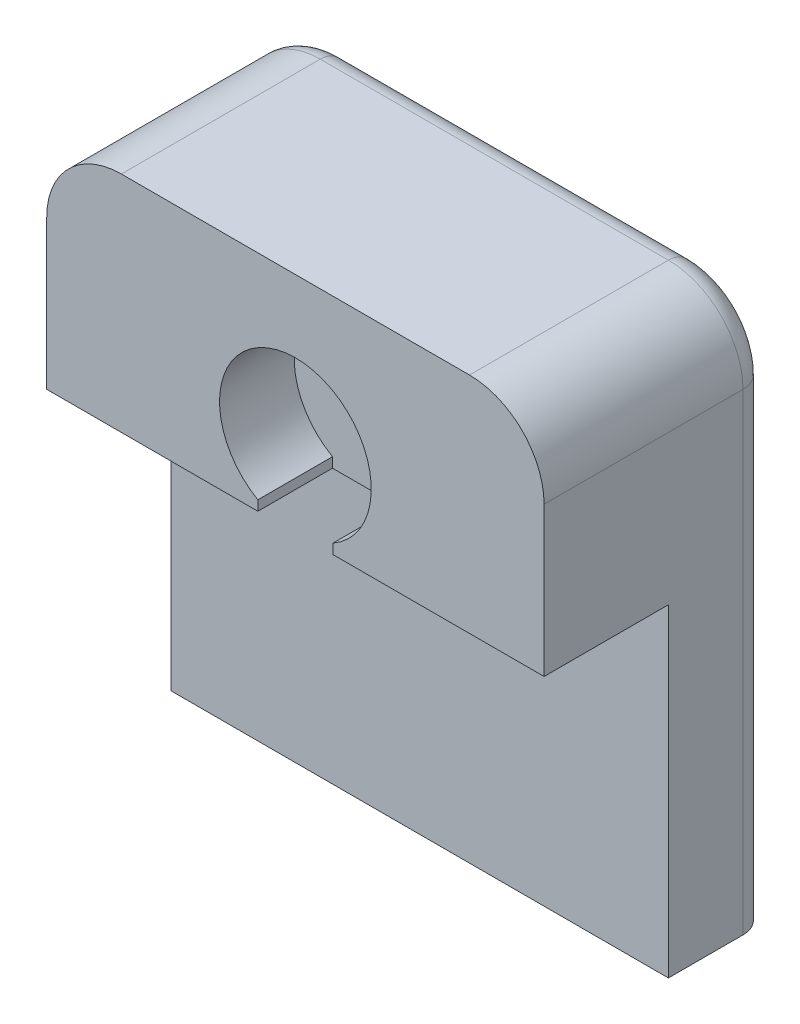
ISO-10303-21;
HEADER;
FILE_DESCRIPTION(('STEP AP214'),'2;1');
FILE_NAME('part.step','',(''),(''),'','','');
FILE_SCHEMA(('AUTOMOTIVE_DESIGN { 1 0 10303 214 1 1 1 1 }'));
ENDSEC;
DATA;
#1=APPLICATION_CONTEXT('core data for automotive mechanical design processes');
#2=APPLICATION_PROTOCOL_DEFINITION('international standard','automotive_design',2000,#1);
#3=PRODUCT_CONTEXT('',#1,'mechanical');
#4=PRODUCT('Part','Part','',(#3));
#5=PRODUCT_RELATED_PRODUCT_CATEGORY('part','',(#4));
#6=PRODUCT_DEFINITION_FORMATION('','',#4);
#7=PRODUCT_DEFINITION_CONTEXT('part definition',#1,'design');
#8=PRODUCT_DEFINITION('design','',#6,#7);
#9=PRODUCT_DEFINITION_SHAPE('','',#8);
#10=(LENGTH_UNIT() NAMED_UNIT(*) SI_UNIT(.MILLI.,.METRE.));
#11=(NAMED_UNIT(*) PLANE_ANGLE_UNIT() SI_UNIT($,.RADIAN.));
#12=(NAMED_UNIT(*) SI_UNIT($,.STERADIAN.) SOLID_ANGLE_UNIT());
#13=UNCERTAINTY_MEASURE_WITH_UNIT(LENGTH_MEASURE(1.E-05),#10,'distance_accuracy_value','');
#14=(GEOMETRIC_REPRESENTATION_CONTEXT(3) GLOBAL_UNCERTAINTY_ASSIGNED_CONTEXT((#13)) GLOBAL_UNIT_ASSIGNED_CONTEXT((#10,
#11,#12)) REPRESENTATION_CONTEXT('',''));
#15=CARTESIAN_POINT('',(0.,0.,0.));
#16=DIRECTION('',(0.,0.,1.));
#17=DIRECTION('',(1.,0.,0.));
#18=AXIS2_PLACEMENT_3D('',#15,#16,#17);
#19=CARTESIAN_POINT('',(-10.,4.5,13.));
#20=DIRECTION('',(1.,0.,0.));
#21=DIRECTION('',(0.,0.,-1.));
#22=AXIS2_PLACEMENT_3D('',#19,#20,#21);
#23=PLANE('',#22);
#24=DIRECTION('',(0.,0.,-1.));
#25=VECTOR('',#24,1.);
#26=CARTESIAN_POINT('',(-10.,1.5,13.));
#27=LINE('',#26,#25);
#28=CARTESIAN_POINT('',(-10.,1.5,13.));
#29=VERTEX_POINT('',#28);
#30=CARTESIAN_POINT('',(-10.,1.5,5.));
#31=VERTEX_POINT('',#30);
#32=EDGE_CURVE('E251',#29,#31,#27,.T.);
#33=ORIENTED_EDGE('',*,*,#32,.T.);
#34=DIRECTION('',(0.,-1.,0.));
#35=VECTOR('',#34,1.);
#36=CARTESIAN_POINT('',(-10.,-17.5,5.));
#37=LINE('',#36,#35);
#38=CARTESIAN_POINT('',(-10.,-17.5,5.));
#39=VERTEX_POINT('',#38);
#40=EDGE_CURVE('E11',#31,#39,#37,.T.);
#41=ORIENTED_EDGE('',*,*,#40,.T.);
#42=DIRECTION('',(0.,0.,-1.));
#43=VECTOR('',#42,1.);
#44=CARTESIAN_POINT('',(-10.,-17.5,0.));
#45=LINE('',#44,#43);
#46=CARTESIAN_POINT('',(-10.,-17.5,8.));
#47=VERTEX_POINT('',#46);
#48=EDGE_CURVE('E189',#47,#39,#45,.T.);
#49=ORIENTED_EDGE('',*,*,#48,.F.);
#50=DIRECTION('',(0.,1.,0.));
#51=VECTOR('',#50,1.);
#52=CARTESIAN_POINT('',(-10.,-17.5,8.));
#53=LINE('',#52,#51);
#54=CARTESIAN_POINT('',(-10.,-4.5,8.));
#55=VERTEX_POINT('',#54);
#56=EDGE_CURVE('E177',#47,#55,#53,.T.);
#57=ORIENTED_EDGE('',*,*,#56,.T.);
#58=DIRECTION('',(0.,0.,-1.));
#59=VECTOR('',#58,1.);
#60=CARTESIAN_POINT('',(-10.,-4.5,13.));
#61=LINE('',#60,#59);
#62=CARTESIAN_POINT('',(-10.,-4.5,13.));
#63=VERTEX_POINT('',#62);
#64=EDGE_CURVE('E247',#63,#55,#61,.T.);
#65=ORIENTED_EDGE('',*,*,#64,.F.);
#66=DIRECTION('',(0.,-1.,0.));
#67=VECTOR('',#66,1.);
#68=CARTESIAN_POINT('',(-10.,4.5,13.));
#69=LINE('',#68,#67);
#70=EDGE_CURVE('E219',#29,#63,#69,.T.);
#71=ORIENTED_EDGE('',*,*,#70,.F.);
#72=EDGE_LOOP('',(#33,#41,#49,#57,#65,#71));
#73=FACE_BOUND('',#72,.T.);
#74=ADVANCED_FACE('F43',(#73),#23,.F.);
#75=CARTESIAN_POINT('',(10.,-4.5,13.));
#76=DIRECTION('',(0.,1.,0.));
#77=DIRECTION('',(-1.,0.,0.));
#78=AXIS2_PLACEMENT_3D('',#75,#76,#77);
#79=PLANE('',#78);
#80=ORIENTED_EDGE('',*,*,#64,.T.);
#81=DIRECTION('',(1.,0.,0.));
#82=VECTOR('',#81,1.);
#83=CARTESIAN_POINT('',(0.,-4.5,8.));
#84=LINE('',#83,#82);
#85=CARTESIAN_POINT('',(10.,-4.5,8.));
#86=VERTEX_POINT('',#85);
#87=EDGE_CURVE('E187',#55,#86,#84,.T.);
#88=ORIENTED_EDGE('',*,*,#87,.T.);
#89=DIRECTION('',(0.,0.,-1.));
#90=VECTOR('',#89,1.);
#91=CARTESIAN_POINT('',(10.,-4.5,13.));
#92=LINE('',#91,#90);
#93=CARTESIAN_POINT('',(10.,-4.5,13.));
#94=VERTEX_POINT('',#93);
#95=EDGE_CURVE('E171',#94,#86,#92,.T.);
#96=ORIENTED_EDGE('',*,*,#95,.F.);
#97=DIRECTION('',(1.,0.,0.));
#98=VECTOR('',#97,1.);
#99=CARTESIAN_POINT('',(10.,-4.5,13.));
#100=LINE('',#99,#98);
#101=CARTESIAN_POINT('',(1.51,-4.5,13.));
#102=VERTEX_POINT('',#101);
#103=EDGE_CURVE('E232',#102,#94,#100,.T.);
#104=ORIENTED_EDGE('',*,*,#103,.F.);
#105=DIRECTION('',(0.,0.,1.));
#106=VECTOR('',#105,1.);
#107=CARTESIAN_POINT('',(1.51,-4.5,10.));
#108=LINE('',#107,#106);
#109=CARTESIAN_POINT('',(1.51,-4.5,10.));
#110=VERTEX_POINT('',#109);
#111=EDGE_CURVE('E220',#110,#102,#108,.T.);
#112=ORIENTED_EDGE('',*,*,#111,.F.);
#113=DIRECTION('',(1.,0.,0.));
#114=VECTOR('',#113,1.);
#115=CARTESIAN_POINT('',(0.,-4.5,10.));
#116=LINE('',#115,#114);
#117=CARTESIAN_POINT('',(-1.51,-4.5,10.));
#118=VERTEX_POINT('',#117);
#119=EDGE_CURVE('E199',#118,#110,#116,.T.);
#120=ORIENTED_EDGE('',*,*,#119,.F.);
#121=DIRECTION('',(0.,0.,1.));
#122=VECTOR('',#121,1.);
#123=CARTESIAN_POINT('',(-1.51,-4.5,10.));
#124=LINE('',#123,#122);
#125=CARTESIAN_POINT('',(-1.51,-4.5,13.));
#126=VERTEX_POINT('',#125);
#127=EDGE_CURVE('E223',#118,#126,#124,.T.);
#128=ORIENTED_EDGE('',*,*,#127,.T.);
#129=EDGE_CURVE('E233',#63,#126,#100,.T.);
#130=ORIENTED_EDGE('',*,*,#129,.F.);
#131=EDGE_LOOP('',(#80,#88,#96,#104,#112,#120,#128,#130));
#132=FACE_BOUND('',#131,.T.);
#133=ADVANCED_FACE('F354',(#132),#79,.F.);
#134=CARTESIAN_POINT('',(10.,4.5,13.));
#135=DIRECTION('',(-1.,0.,0.));
#136=DIRECTION('',(0.,0.,1.));
#137=AXIS2_PLACEMENT_3D('',#134,#135,#136);
#138=PLANE('',#137);
#139=DIRECTION('',(0.,0.,1.));
#140=VECTOR('',#139,1.);
#141=CARTESIAN_POINT('',(10.,-17.5,0.));
#142=LINE('',#141,#140);
#143=CARTESIAN_POINT('',(10.,-17.5,5.));
#144=VERTEX_POINT('',#143);
#145=CARTESIAN_POINT('',(10.,-17.5,8.));
#146=VERTEX_POINT('',#145);
#147=EDGE_CURVE('E153',#144,#146,#142,.T.);
#148=ORIENTED_EDGE('',*,*,#147,.F.);
#149=DIRECTION('',(0.,-1.,0.));
#150=VECTOR('',#149,1.);
#151=CARTESIAN_POINT('',(10.,1.50000000000002,5.));
#152=LINE('',#151,#150);
#153=CARTESIAN_POINT('',(10.,1.5,5.));
#154=VERTEX_POINT('',#153);
#155=EDGE_CURVE('E290',#144,#154,#152,.F.);
#156=ORIENTED_EDGE('',*,*,#155,.T.);
#157=DIRECTION('',(0.,0.,-1.));
#158=VECTOR('',#157,1.);
#159=CARTESIAN_POINT('',(10.,1.5,13.));
#160=LINE('',#159,#158);
#161=CARTESIAN_POINT('',(10.,1.5,13.));
#162=VERTEX_POINT('',#161);
#163=EDGE_CURVE('E266',#154,#162,#160,.F.);
#164=ORIENTED_EDGE('',*,*,#163,.T.);
#165=DIRECTION('',(0.,1.,0.));
#166=VECTOR('',#165,1.);
#167=CARTESIAN_POINT('',(10.,4.5,13.));
#168=LINE('',#167,#166);
#169=EDGE_CURVE('E237',#94,#162,#168,.T.);
#170=ORIENTED_EDGE('',*,*,#169,.F.);
#171=ORIENTED_EDGE('',*,*,#95,.T.);
#172=DIRECTION('',(0.,1.,0.));
#173=VECTOR('',#172,1.);
#174=CARTESIAN_POINT('',(10.,-17.5,8.));
#175=LINE('',#174,#173);
#176=EDGE_CURVE('E167',#146,#86,#175,.T.);
#177=ORIENTED_EDGE('',*,*,#176,.F.);
#178=EDGE_LOOP('',(#148,#156,#164,#170,#171,#177));
#179=FACE_BOUND('',#178,.T.);
#180=ADVANCED_FACE('F168',(#179),#138,.F.);
#181=CARTESIAN_POINT('',(10.,4.5,13.));
#182=DIRECTION('',(0.,-1.,0.));
#183=DIRECTION('',(1.,0.,0.));
#184=AXIS2_PLACEMENT_3D('',#181,#182,#183);
#185=PLANE('',#184);
#186=DIRECTION('',(0.,0.,-1.));
#187=VECTOR('',#186,1.);
#188=CARTESIAN_POINT('',(7.,4.5,13.));
#189=LINE('',#188,#187);
#190=CARTESIAN_POINT('',(7.,4.5,13.));
#191=VERTEX_POINT('',#190);
#192=CARTESIAN_POINT('',(7.,4.5,5.));
#193=VERTEX_POINT('',#192);
#194=EDGE_CURVE('E254',#191,#193,#189,.T.);
#195=ORIENTED_EDGE('',*,*,#194,.T.);
#196=DIRECTION('',(1.,0.,0.));
#197=VECTOR('',#196,1.);
#198=CARTESIAN_POINT('',(-7.,4.5,5.));
#199=LINE('',#198,#197);
#200=CARTESIAN_POINT('',(-7.,4.5,5.));
#201=VERTEX_POINT('',#200);
#202=EDGE_CURVE('E68',#193,#201,#199,.F.);
#203=ORIENTED_EDGE('',*,*,#202,.T.);
#204=DIRECTION('',(0.,0.,-1.));
#205=VECTOR('',#204,1.);
#206=CARTESIAN_POINT('',(-7.,4.5,13.));
#207=LINE('',#206,#205);
#208=CARTESIAN_POINT('',(-7.,4.5,13.));
#209=VERTEX_POINT('',#208);
#210=EDGE_CURVE('E257',#201,#209,#207,.F.);
#211=ORIENTED_EDGE('',*,*,#210,.T.);
#212=DIRECTION('',(-1.,0.,0.));
#213=VECTOR('',#212,1.);
#214=CARTESIAN_POINT('',(10.,4.5,13.));
#215=LINE('',#214,#213);
#216=EDGE_CURVE('E241',#191,#209,#215,.T.);
#217=ORIENTED_EDGE('',*,*,#216,.F.);
#218=EDGE_LOOP('',(#195,#203,#211,#217));
#219=FACE_BOUND('',#218,.T.);
#220=ADVANCED_FACE('F366',(#219),#185,.F.);
#221=CARTESIAN_POINT('',(-7.,1.5,13.));
#222=DIRECTION('',(0.,0.,-1.));
#223=DIRECTION('',(-1.,0.,0.));
#224=AXIS2_PLACEMENT_3D('',#221,#222,#223);
#225=CYLINDRICAL_SURFACE('',#224,3.);
#226=ORIENTED_EDGE('',*,*,#210,.F.);
#227=CARTESIAN_POINT('',(-7.,1.5,5.));
#228=DIRECTION('',(0.,0.,-1.));
#229=DIRECTION('',(-1.,0.,0.));
#230=AXIS2_PLACEMENT_3D('',#227,#228,#229);
#231=CIRCLE('',#230,3.);
#232=EDGE_CURVE('E53',#201,#31,#231,.F.);
#233=ORIENTED_EDGE('',*,*,#232,.T.);
#234=ORIENTED_EDGE('',*,*,#32,.F.);
#235=CARTESIAN_POINT('',(-7.,1.5,13.));
#236=DIRECTION('',(0.,0.,-1.));
#237=DIRECTION('',(-1.,0.,0.));
#238=AXIS2_PLACEMENT_3D('',#235,#236,#237);
#239=CIRCLE('',#238,3.);
#240=EDGE_CURVE('E263',#209,#29,#239,.F.);
#241=ORIENTED_EDGE('',*,*,#240,.F.);
#242=EDGE_LOOP('',(#226,#233,#234,#241));
#243=FACE_BOUND('',#242,.T.);
#244=ADVANCED_FACE('F363',(#243),#225,.T.);
#245=CARTESIAN_POINT('',(7.,1.5,13.));
#246=DIRECTION('',(0.,0.,-1.));
#247=DIRECTION('',(-1.,0.,0.));
#248=AXIS2_PLACEMENT_3D('',#245,#246,#247);
#249=CYLINDRICAL_SURFACE('',#248,3.);
#250=ORIENTED_EDGE('',*,*,#163,.F.);
#251=CARTESIAN_POINT('',(7.,1.5,5.));
#252=DIRECTION('',(0.,0.,-1.));
#253=DIRECTION('',(-1.,0.,0.));
#254=AXIS2_PLACEMENT_3D('',#251,#252,#253);
#255=CIRCLE('',#254,3.);
#256=EDGE_CURVE('E293',#154,#193,#255,.F.);
#257=ORIENTED_EDGE('',*,*,#256,.T.);
#258=ORIENTED_EDGE('',*,*,#194,.F.);
#259=CARTESIAN_POINT('',(7.,1.5,13.));
#260=DIRECTION('',(0.,0.,-1.));
#261=DIRECTION('',(-1.,0.,0.));
#262=AXIS2_PLACEMENT_3D('',#259,#260,#261);
#263=CIRCLE('',#262,3.);
#264=EDGE_CURVE('E260',#162,#191,#263,.F.);
#265=ORIENTED_EDGE('',*,*,#264,.F.);
#266=EDGE_LOOP('',(#250,#257,#258,#265));
#267=FACE_BOUND('',#266,.T.);
#268=ADVANCED_FACE('F340',(#267),#249,.T.);
#269=CARTESIAN_POINT('',(0.,0.,13.));
#270=DIRECTION('',(0.,0.,-1.));
#271=DIRECTION('',(-1.,0.,0.));
#272=AXIS2_PLACEMENT_3D('',#269,#270,#271);
#273=PLANE('',#272);
#274=ORIENTED_EDGE('',*,*,#216,.T.);
#275=ORIENTED_EDGE('',*,*,#240,.T.);
#276=ORIENTED_EDGE('',*,*,#70,.T.);
#277=ORIENTED_EDGE('',*,*,#129,.T.);
#278=DIRECTION('',(0.,1.,0.));
#279=VECTOR('',#278,1.);
#280=CARTESIAN_POINT('',(-1.51,0.,13.));
#281=LINE('',#280,#279);
#282=CARTESIAN_POINT('',(-1.51,-4.0999811320083,13.));
#283=VERTEX_POINT('',#282);
#284=EDGE_CURVE('E209',#126,#283,#281,.T.);
#285=ORIENTED_EDGE('',*,*,#284,.T.);
#286=CARTESIAN_POINT('',(0.,-1.45,13.));
#287=DIRECTION('',(0.,0.,1.));
#288=DIRECTION('',(1.,0.,0.));
#289=AXIS2_PLACEMENT_3D('',#286,#287,#288);
#290=CIRCLE('',#289,3.05);
#291=CARTESIAN_POINT('',(1.51,-4.0999811320083,13.));
#292=VERTEX_POINT('',#291);
#293=EDGE_CURVE('E176',#292,#283,#290,.T.);
#294=ORIENTED_EDGE('',*,*,#293,.F.);
#295=DIRECTION('',(0.,1.,0.));
#296=VECTOR('',#295,1.);
#297=CARTESIAN_POINT('',(1.51,0.,13.));
#298=LINE('',#297,#296);
#299=EDGE_CURVE('E196',#102,#292,#298,.T.);
#300=ORIENTED_EDGE('',*,*,#299,.F.);
#301=ORIENTED_EDGE('',*,*,#103,.T.);
#302=ORIENTED_EDGE('',*,*,#169,.T.);
#303=ORIENTED_EDGE('',*,*,#264,.T.);
#304=EDGE_LOOP('',(#274,#275,#276,#277,#285,#294,#300,#301,#302,#303));
#305=FACE_BOUND('',#304,.T.);
#306=ADVANCED_FACE('F369',(#305),#273,.F.);
#307=CARTESIAN_POINT('',(0.,-1.45,10.));
#308=DIRECTION('',(0.,0.,1.));
#309=DIRECTION('',(1.,0.,0.));
#310=AXIS2_PLACEMENT_3D('',#307,#308,#309);
#311=CYLINDRICAL_SURFACE('',#310,3.05);
#312=ORIENTED_EDGE('',*,*,#293,.T.);
#313=DIRECTION('',(0.,0.,1.));
#314=VECTOR('',#313,1.);
#315=CARTESIAN_POINT('',(-1.51,-4.0999811320083,10.));
#316=LINE('',#315,#314);
#317=CARTESIAN_POINT('',(-1.51,-4.0999811320083,10.));
#318=VERTEX_POINT('',#317);
#319=EDGE_CURVE('E206',#318,#283,#316,.T.);
#320=ORIENTED_EDGE('',*,*,#319,.F.);
#321=CARTESIAN_POINT('',(0.,-1.45,10.));
#322=DIRECTION('',(0.,0.,1.));
#323=DIRECTION('',(1.,0.,0.));
#324=AXIS2_PLACEMENT_3D('',#321,#322,#323);
#325=CIRCLE('',#324,3.05);
#326=CARTESIAN_POINT('',(1.51,-4.0999811320083,10.));
#327=VERTEX_POINT('',#326);
#328=EDGE_CURVE('E191',#327,#318,#325,.T.);
#329=ORIENTED_EDGE('',*,*,#328,.F.);
#330=DIRECTION('',(0.,0.,1.));
#331=VECTOR('',#330,1.);
#332=CARTESIAN_POINT('',(1.51,-4.0999811320083,10.));
#333=LINE('',#332,#331);
#334=EDGE_CURVE('E216',#327,#292,#333,.T.);
#335=ORIENTED_EDGE('',*,*,#334,.T.);
#336=EDGE_LOOP('',(#312,#320,#329,#335));
#337=FACE_BOUND('',#336,.T.);
#338=ADVANCED_FACE('F473',(#337),#311,.F.);
#339=CARTESIAN_POINT('',(1.51,0.,10.));
#340=DIRECTION('',(1.,0.,0.));
#341=DIRECTION('',(0.,1.,0.));
#342=AXIS2_PLACEMENT_3D('',#339,#340,#341);
#343=PLANE('',#342);
#344=ORIENTED_EDGE('',*,*,#299,.T.);
#345=ORIENTED_EDGE('',*,*,#334,.F.);
#346=DIRECTION('',(0.,1.,0.));
#347=VECTOR('',#346,1.);
#348=CARTESIAN_POINT('',(1.51,0.,10.));
#349=LINE('',#348,#347);
#350=EDGE_CURVE('E202',#110,#327,#349,.T.);
#351=ORIENTED_EDGE('',*,*,#350,.F.);
#352=ORIENTED_EDGE('',*,*,#111,.T.);
#353=EDGE_LOOP('',(#344,#345,#351,#352));
#354=FACE_BOUND('',#353,.T.);
#355=ADVANCED_FACE('F494',(#354),#343,.F.);
#356=CARTESIAN_POINT('',(-1.51,0.,10.));
#357=DIRECTION('',(1.,0.,0.));
#358=DIRECTION('',(0.,0.,-1.));
#359=AXIS2_PLACEMENT_3D('',#356,#357,#358);
#360=PLANE('',#359);
#361=ORIENTED_EDGE('',*,*,#284,.F.);
#362=ORIENTED_EDGE('',*,*,#127,.F.);
#363=DIRECTION('',(0.,1.,0.));
#364=VECTOR('',#363,1.);
#365=CARTESIAN_POINT('',(-1.51,0.,10.));
#366=LINE('',#365,#364);
#367=EDGE_CURVE('E195',#118,#318,#366,.T.);
#368=ORIENTED_EDGE('',*,*,#367,.T.);
#369=ORIENTED_EDGE('',*,*,#319,.T.);
#370=EDGE_LOOP('',(#361,#362,#368,#369));
#371=FACE_BOUND('',#370,.T.);
#372=ADVANCED_FACE('F483',(#371),#360,.T.);
#373=CARTESIAN_POINT('',(0.,0.,10.));
#374=DIRECTION('',(0.,0.,1.));
#375=DIRECTION('',(1.,0.,0.));
#376=AXIS2_PLACEMENT_3D('',#373,#374,#375);
#377=PLANE('',#376);
#378=ORIENTED_EDGE('',*,*,#328,.T.);
#379=ORIENTED_EDGE('',*,*,#367,.F.);
#380=ORIENTED_EDGE('',*,*,#119,.T.);
#381=ORIENTED_EDGE('',*,*,#350,.T.);
#382=EDGE_LOOP('',(#378,#379,#380,#381));
#383=FACE_BOUND('',#382,.T.);
#384=ADVANCED_FACE('F415',(#383),#377,.T.);
#385=CARTESIAN_POINT('',(0.,56.5,4.));
#386=DIRECTION('',(0.,0.,-1.));
#387=DIRECTION('',(-1.,0.,0.));
#388=AXIS2_PLACEMENT_3D('',#385,#386,#387);
#389=PLANE('',#388);
#390=CARTESIAN_POINT('',(7.,1.5,4.));
#391=DIRECTION('',(0.,0.,-1.));
#392=DIRECTION('',(-1.,0.,0.));
#393=AXIS2_PLACEMENT_3D('',#390,#391,#392);
#394=CIRCLE('',#393,2.);
#395=CARTESIAN_POINT('',(7.,3.5,4.));
#396=VERTEX_POINT('',#395);
#397=CARTESIAN_POINT('',(9.,1.5,4.));
#398=VERTEX_POINT('',#397);
#399=EDGE_CURVE('E278',#396,#398,#394,.T.);
#400=ORIENTED_EDGE('',*,*,#399,.T.);
#401=DIRECTION('',(0.,-1.,0.));
#402=VECTOR('',#401,1.);
#403=CARTESIAN_POINT('',(9.,-17.5,4.));
#404=LINE('',#403,#402);
#405=CARTESIAN_POINT('',(9.,-17.5,4.));
#406=VERTEX_POINT('',#405);
#407=EDGE_CURVE('E281',#398,#406,#404,.T.);
#408=ORIENTED_EDGE('',*,*,#407,.T.);
#409=DIRECTION('',(1.,0.,0.));
#410=VECTOR('',#409,1.);
#411=CARTESIAN_POINT('',(0.,-17.5,4.));
#412=LINE('',#411,#410);
#413=CARTESIAN_POINT('',(-9.,-17.5,4.));
#414=VERTEX_POINT('',#413);
#415=EDGE_CURVE('E164',#414,#406,#412,.T.);
#416=ORIENTED_EDGE('',*,*,#415,.F.);
#417=DIRECTION('',(0.,-1.,0.));
#418=VECTOR('',#417,1.);
#419=CARTESIAN_POINT('',(-9.,1.50000000000002,4.));
#420=LINE('',#419,#418);
#421=CARTESIAN_POINT('',(-9.,1.5,4.));
#422=VERTEX_POINT('',#421);
#423=EDGE_CURVE('E269',#414,#422,#420,.F.);
#424=ORIENTED_EDGE('',*,*,#423,.T.);
#425=CARTESIAN_POINT('',(-7.,1.5,4.));
#426=DIRECTION('',(0.,0.,-1.));
#427=DIRECTION('',(-1.,0.,0.));
#428=AXIS2_PLACEMENT_3D('',#425,#426,#427);
#429=CIRCLE('',#428,2.);
#430=CARTESIAN_POINT('',(-7.,3.5,4.));
#431=VERTEX_POINT('',#430);
#432=EDGE_CURVE('E272',#422,#431,#429,.T.);
#433=ORIENTED_EDGE('',*,*,#432,.T.);
#434=DIRECTION('',(1.,0.,0.));
#435=VECTOR('',#434,1.);
#436=CARTESIAN_POINT('',(7.,3.5,4.));
#437=LINE('',#436,#435);
#438=EDGE_CURVE('E275',#431,#396,#437,.T.);
#439=ORIENTED_EDGE('',*,*,#438,.T.);
#440=EDGE_LOOP('',(#400,#408,#416,#424,#433,#439));
#441=FACE_BOUND('',#440,.T.);
#442=ADVANCED_FACE('F330',(#441),#389,.T.);
#443=CARTESIAN_POINT('',(0.,-17.5,8.));
#444=DIRECTION('',(0.,0.,1.));
#445=DIRECTION('',(1.,0.,0.));
#446=AXIS2_PLACEMENT_3D('',#443,#444,#445);
#447=PLANE('',#446);
#448=ORIENTED_EDGE('',*,*,#87,.F.);
#449=ORIENTED_EDGE('',*,*,#56,.F.);
#450=DIRECTION('',(1.,0.,0.));
#451=VECTOR('',#450,1.);
#452=CARTESIAN_POINT('',(0.,-17.5,8.));
#453=LINE('',#452,#451);
#454=EDGE_CURVE('E159',#47,#146,#453,.T.);
#455=ORIENTED_EDGE('',*,*,#454,.T.);
#456=ORIENTED_EDGE('',*,*,#176,.T.);
#457=EDGE_LOOP('',(#448,#449,#455,#456));
#458=FACE_BOUND('',#457,.T.);
#459=ADVANCED_FACE('F179',(#458),#447,.T.);
#460=CARTESIAN_POINT('',(0.,-17.5,0.));
#461=DIRECTION('',(0.,-1.,0.));
#462=DIRECTION('',(1.,0.,0.));
#463=AXIS2_PLACEMENT_3D('',#460,#461,#462);
#464=PLANE('',#463);
#465=ORIENTED_EDGE('',*,*,#415,.T.);
#466=CARTESIAN_POINT('',(9.,-17.5,5.));
#467=DIRECTION('',(0.,-1.,0.));
#468=DIRECTION('',(1.,0.,0.));
#469=AXIS2_PLACEMENT_3D('',#466,#467,#468);
#470=CIRCLE('',#469,1.);
#471=EDGE_CURVE('E160',#406,#144,#470,.T.);
#472=ORIENTED_EDGE('',*,*,#471,.T.);
#473=ORIENTED_EDGE('',*,*,#147,.T.);
#474=ORIENTED_EDGE('',*,*,#454,.F.);
#475=ORIENTED_EDGE('',*,*,#48,.T.);
#476=CARTESIAN_POINT('',(-9.,-17.5,5.));
#477=DIRECTION('',(0.,-1.,0.));
#478=DIRECTION('',(1.,0.,0.));
#479=AXIS2_PLACEMENT_3D('',#476,#477,#478);
#480=CIRCLE('',#479,1.);
#481=EDGE_CURVE('E285',#39,#414,#480,.T.);
#482=ORIENTED_EDGE('',*,*,#481,.T.);
#483=EDGE_LOOP('',(#465,#472,#473,#474,#475,#482));
#484=FACE_BOUND('',#483,.T.);
#485=ADVANCED_FACE('F156',(#484),#464,.T.);
#486=CARTESIAN_POINT('',(-9.,4.5,5.));
#487=DIRECTION('',(0.,1.,0.));
#488=DIRECTION('',(0.,0.,1.));
#489=AXIS2_PLACEMENT_3D('',#486,#487,#488);
#490=CYLINDRICAL_SURFACE('',#489,1.);
#491=ORIENTED_EDGE('',*,*,#481,.F.);
#492=ORIENTED_EDGE('',*,*,#40,.F.);
#493=CARTESIAN_POINT('',(-9.,1.5,5.));
#494=DIRECTION('',(0.,1.,0.));
#495=DIRECTION('',(0.,0.,1.));
#496=AXIS2_PLACEMENT_3D('',#493,#494,#495);
#497=CIRCLE('',#496,1.);
#498=EDGE_CURVE('E47',#422,#31,#497,.T.);
#499=ORIENTED_EDGE('',*,*,#498,.F.);
#500=ORIENTED_EDGE('',*,*,#423,.F.);
#501=EDGE_LOOP('',(#491,#492,#499,#500));
#502=FACE_BOUND('',#501,.T.);
#503=ADVANCED_FACE('F45',(#502),#490,.T.);
#504=CARTESIAN_POINT('',(-7.,1.5,5.));
#505=DIRECTION('',(0.,0.,-1.));
#506=DIRECTION('',(-1.,0.,0.));
#507=AXIS2_PLACEMENT_3D('',#504,#505,#506);
#508=TOROIDAL_SURFACE('',#507,2.,1.);
#509=ORIENTED_EDGE('',*,*,#498,.T.);
#510=ORIENTED_EDGE('',*,*,#232,.F.);
#511=CARTESIAN_POINT('',(-7.,3.5,5.));
#512=DIRECTION('',(1.,0.,0.));
#513=DIRECTION('',(0.,0.,-1.));
#514=AXIS2_PLACEMENT_3D('',#511,#512,#513);
#515=CIRCLE('',#514,1.);
#516=EDGE_CURVE('E307',#431,#201,#515,.T.);
#517=ORIENTED_EDGE('',*,*,#516,.F.);
#518=ORIENTED_EDGE('',*,*,#432,.F.);
#519=EDGE_LOOP('',(#509,#510,#517,#518));
#520=FACE_BOUND('',#519,.T.);
#521=ADVANCED_FACE('F318',(#520),#508,.T.);
#522=CARTESIAN_POINT('',(0.,3.5,5.));
#523=DIRECTION('',(-1.,0.,0.));
#524=DIRECTION('',(0.,-1.,0.));
#525=AXIS2_PLACEMENT_3D('',#522,#523,#524);
#526=CYLINDRICAL_SURFACE('',#525,1.);
#527=ORIENTED_EDGE('',*,*,#516,.T.);
#528=ORIENTED_EDGE('',*,*,#202,.F.);
#529=CARTESIAN_POINT('',(7.,3.5,5.));
#530=DIRECTION('',(1.,0.,0.));
#531=DIRECTION('',(0.,0.,-1.));
#532=AXIS2_PLACEMENT_3D('',#529,#530,#531);
#533=CIRCLE('',#532,1.);
#534=EDGE_CURVE('E304',#396,#193,#533,.T.);
#535=ORIENTED_EDGE('',*,*,#534,.F.);
#536=ORIENTED_EDGE('',*,*,#438,.F.);
#537=EDGE_LOOP('',(#527,#528,#535,#536));
#538=FACE_BOUND('',#537,.T.);
#539=ADVANCED_FACE('F345',(#538),#526,.T.);
#540=CARTESIAN_POINT('',(7.,1.5,5.));
#541=DIRECTION('',(0.,0.,-1.));
#542=DIRECTION('',(-1.,0.,0.));
#543=AXIS2_PLACEMENT_3D('',#540,#541,#542);
#544=TOROIDAL_SURFACE('',#543,2.,1.);
#545=ORIENTED_EDGE('',*,*,#534,.T.);
#546=ORIENTED_EDGE('',*,*,#256,.F.);
#547=CARTESIAN_POINT('',(9.,1.5,5.));
#548=DIRECTION('',(0.,-1.,0.));
#549=DIRECTION('',(0.,0.,-1.));
#550=AXIS2_PLACEMENT_3D('',#547,#548,#549);
#551=CIRCLE('',#550,1.);
#552=EDGE_CURVE('E300',#398,#154,#551,.T.);
#553=ORIENTED_EDGE('',*,*,#552,.F.);
#554=ORIENTED_EDGE('',*,*,#399,.F.);
#555=EDGE_LOOP('',(#545,#546,#553,#554));
#556=FACE_BOUND('',#555,.T.);
#557=ADVANCED_FACE('F343',(#556),#544,.T.);
#558=CARTESIAN_POINT('',(9.,56.5,5.));
#559=DIRECTION('',(0.,1.,0.));
#560=DIRECTION('',(0.,0.,1.));
#561=AXIS2_PLACEMENT_3D('',#558,#559,#560);
#562=CYLINDRICAL_SURFACE('',#561,1.);
#563=ORIENTED_EDGE('',*,*,#552,.T.);
#564=ORIENTED_EDGE('',*,*,#155,.F.);
#565=ORIENTED_EDGE('',*,*,#471,.F.);
#566=ORIENTED_EDGE('',*,*,#407,.F.);
#567=EDGE_LOOP('',(#563,#564,#565,#566));
#568=FACE_BOUND('',#567,.T.);
#569=ADVANCED_FACE('F335',(#568),#562,.T.);
#570=CLOSED_SHELL('',(#74,#133,#180,#220,#244,#268,#306,#338,#355,#372,#384,#442,#459,#485,#503,
#521,#539,#557,#569));
#571=MANIFOLD_SOLID_BREP('B2',#570);
#572=ADVANCED_BREP_SHAPE_REPRESENTATION('',(#18,#571),#14);
#573=SHAPE_DEFINITION_REPRESENTATION(#9,#572);
ENDSEC;
END-ISO-10303-21;
